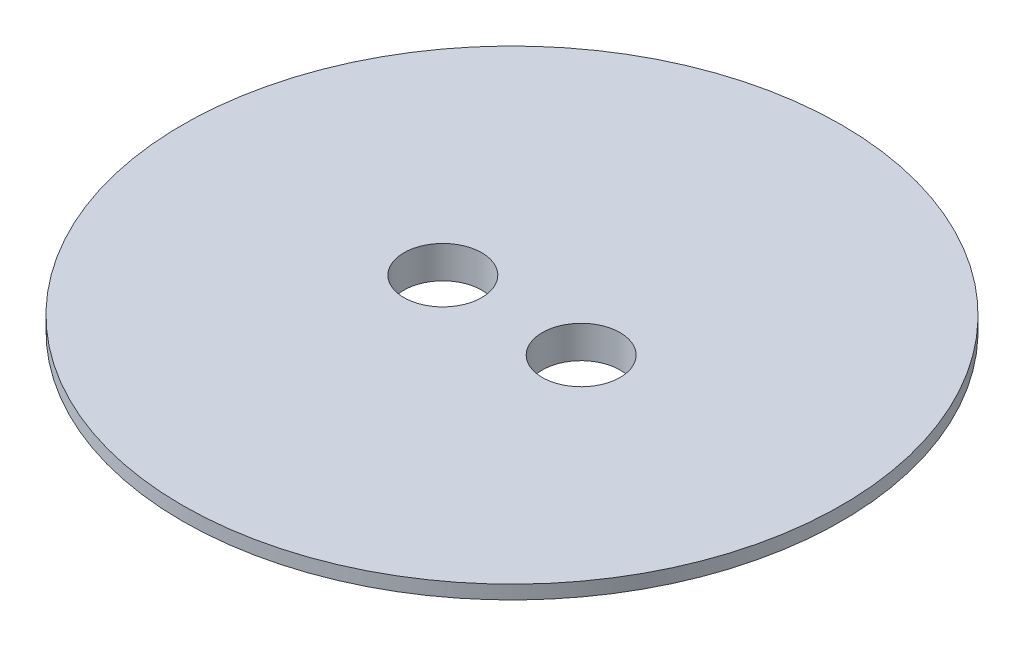
ISO-10303-21;
HEADER;
FILE_DESCRIPTION(('STEP AP214'),'2;1');
FILE_NAME('part.step','',(''),(''),'','','');
FILE_SCHEMA(('AUTOMOTIVE_DESIGN { 1 0 10303 214 1 1 1 1 }'));
ENDSEC;
DATA;
#1=APPLICATION_CONTEXT('core data for automotive mechanical design processes');
#2=APPLICATION_PROTOCOL_DEFINITION('international standard','automotive_design',2000,#1);
#3=PRODUCT_CONTEXT('',#1,'mechanical');
#4=PRODUCT('Part','Part','',(#3));
#5=PRODUCT_RELATED_PRODUCT_CATEGORY('part','',(#4));
#6=PRODUCT_DEFINITION_FORMATION('','',#4);
#7=PRODUCT_DEFINITION_CONTEXT('part definition',#1,'design');
#8=PRODUCT_DEFINITION('design','',#6,#7);
#9=PRODUCT_DEFINITION_SHAPE('','',#8);
#10=(LENGTH_UNIT() NAMED_UNIT(*) SI_UNIT(.MILLI.,.METRE.));
#11=(NAMED_UNIT(*) PLANE_ANGLE_UNIT() SI_UNIT($,.RADIAN.));
#12=(NAMED_UNIT(*) SI_UNIT($,.STERADIAN.) SOLID_ANGLE_UNIT());
#13=UNCERTAINTY_MEASURE_WITH_UNIT(LENGTH_MEASURE(1.E-05),#10,'distance_accuracy_value','');
#14=(GEOMETRIC_REPRESENTATION_CONTEXT(3) GLOBAL_UNCERTAINTY_ASSIGNED_CONTEXT((#13)) GLOBAL_UNIT_ASSIGNED_CONTEXT((#10,
#11,#12)) REPRESENTATION_CONTEXT('',''));
#15=CARTESIAN_POINT('',(0.,0.,0.));
#16=DIRECTION('',(0.,0.,1.));
#17=DIRECTION('',(1.,0.,0.));
#18=AXIS2_PLACEMENT_3D('',#15,#16,#17);
#19=CARTESIAN_POINT('',(-4.064,1.905,0.));
#20=DIRECTION('',(0.,-1.,0.));
#21=DIRECTION('',(0.,0.,-1.));
#22=AXIS2_PLACEMENT_3D('',#19,#20,#21);
#23=CYLINDRICAL_SURFACE('',#22,2.286);
#24=CARTESIAN_POINT('',(-4.064,1.905,0.));
#25=DIRECTION('',(0.,1.,0.));
#26=DIRECTION('',(0.,0.,1.));
#27=AXIS2_PLACEMENT_3D('',#24,#25,#26);
#28=CIRCLE('',#27,2.286);
#29=CARTESIAN_POINT('',(-4.064,1.905,-2.286));
#30=VERTEX_POINT('',#29);
#31=EDGE_CURVE('E64',#30,#30,#28,.T.);
#32=CARTESIAN_POINT('',(-4.064,0.,0.));
#33=DIRECTION('',(0.,1.,0.));
#34=DIRECTION('',(0.,0.,1.));
#35=AXIS2_PLACEMENT_3D('',#32,#33,#34);
#36=CIRCLE('',#35,2.286);
#37=CARTESIAN_POINT('',(-4.064,0.,-2.286));
#38=VERTEX_POINT('',#37);
#39=EDGE_CURVE('E72',#38,#38,#36,.T.);
#40=CARTESIAN_POINT('',(-4.064,1.905,-2.286));
#41=CARTESIAN_POINT('',(-4.064,1.88515625,-2.286));
#42=CARTESIAN_POINT('',(-4.064,1.8653125,-2.286));
#43=CARTESIAN_POINT('',(-4.064,1.825625,-2.286));
#44=CARTESIAN_POINT('',(-4.064,1.80578125,-2.286));
#45=CARTESIAN_POINT('',(-4.064,1.76609375,-2.286));
#46=CARTESIAN_POINT('',(-4.064,1.74625,-2.286));
#47=CARTESIAN_POINT('',(-4.064,1.7065625,-2.286));
#48=CARTESIAN_POINT('',(-4.064,1.68671875,-2.286));
#49=CARTESIAN_POINT('',(-4.064,1.64703125,-2.286));
#50=CARTESIAN_POINT('',(-4.064,1.6271875,-2.286));
#51=CARTESIAN_POINT('',(-4.064,1.5875,-2.286));
#52=CARTESIAN_POINT('',(-4.064,1.56765625,-2.286));
#53=CARTESIAN_POINT('',(-4.064,1.52796875,-2.286));
#54=CARTESIAN_POINT('',(-4.064,1.508125,-2.286));
#55=CARTESIAN_POINT('',(-4.064,1.4684375,-2.286));
#56=CARTESIAN_POINT('',(-4.064,1.44859375,-2.286));
#57=CARTESIAN_POINT('',(-4.064,1.40890625,-2.286));
#58=CARTESIAN_POINT('',(-4.064,1.3890625,-2.286));
#59=CARTESIAN_POINT('',(-4.064,1.349375,-2.286));
#60=CARTESIAN_POINT('',(-4.064,1.32953125,-2.286));
#61=CARTESIAN_POINT('',(-4.064,1.28984375,-2.286));
#62=CARTESIAN_POINT('',(-4.064,1.27,-2.286));
#63=CARTESIAN_POINT('',(-4.064,1.2303125,-2.286));
#64=CARTESIAN_POINT('',(-4.064,1.21046875,-2.286));
#65=CARTESIAN_POINT('',(-4.064,1.17078125,-2.286));
#66=CARTESIAN_POINT('',(-4.064,1.1509375,-2.286));
#67=CARTESIAN_POINT('',(-4.064,1.11125,-2.286));
#68=CARTESIAN_POINT('',(-4.064,1.09140625,-2.286));
#69=CARTESIAN_POINT('',(-4.064,1.05171875,-2.286));
#70=CARTESIAN_POINT('',(-4.064,1.031875,-2.286));
#71=CARTESIAN_POINT('',(-4.064,0.9921875,-2.286));
#72=CARTESIAN_POINT('',(-4.064,0.97234375,-2.286));
#73=CARTESIAN_POINT('',(-4.064,0.93265625,-2.286));
#74=CARTESIAN_POINT('',(-4.064,0.9128125,-2.286));
#75=CARTESIAN_POINT('',(-4.064,0.873125,-2.286));
#76=CARTESIAN_POINT('',(-4.064,0.85328125,-2.286));
#77=CARTESIAN_POINT('',(-4.064,0.81359375,-2.286));
#78=CARTESIAN_POINT('',(-4.064,0.79375,-2.286));
#79=CARTESIAN_POINT('',(-4.064,0.7540625,-2.286));
#80=CARTESIAN_POINT('',(-4.064,0.73421875,-2.286));
#81=CARTESIAN_POINT('',(-4.064,0.69453125,-2.286));
#82=CARTESIAN_POINT('',(-4.064,0.6746875,-2.286));
#83=CARTESIAN_POINT('',(-4.064,0.635,-2.286));
#84=CARTESIAN_POINT('',(-4.064,0.61515625,-2.286));
#85=CARTESIAN_POINT('',(-4.064,0.57546875,-2.286));
#86=CARTESIAN_POINT('',(-4.064,0.555625,-2.286));
#87=CARTESIAN_POINT('',(-4.064,0.5159375,-2.286));
#88=CARTESIAN_POINT('',(-4.064,0.49609375,-2.286));
#89=CARTESIAN_POINT('',(-4.064,0.45640625,-2.286));
#90=CARTESIAN_POINT('',(-4.064,0.4365625,-2.286));
#91=CARTESIAN_POINT('',(-4.064,0.396875,-2.286));
#92=CARTESIAN_POINT('',(-4.064,0.37703125,-2.286));
#93=CARTESIAN_POINT('',(-4.064,0.33734375,-2.286));
#94=CARTESIAN_POINT('',(-4.064,0.3175,-2.286));
#95=CARTESIAN_POINT('',(-4.064,0.2778125,-2.286));
#96=CARTESIAN_POINT('',(-4.064,0.25796875,-2.286));
#97=CARTESIAN_POINT('',(-4.064,0.21828125,-2.286));
#98=CARTESIAN_POINT('',(-4.064,0.1984375,-2.286));
#99=CARTESIAN_POINT('',(-4.064,0.15875,-2.286));
#100=CARTESIAN_POINT('',(-4.064,0.13890625,-2.286));
#101=CARTESIAN_POINT('',(-4.064,0.09921875,-2.286));
#102=CARTESIAN_POINT('',(-4.064,0.0793749999999999,-2.286));
#103=CARTESIAN_POINT('',(-4.064,0.0396874999999999,-2.286));
#104=CARTESIAN_POINT('',(-4.064,0.01984375,-2.286));
#105=CARTESIAN_POINT('',(-4.064,0.,-2.286));
#106=B_SPLINE_CURVE_WITH_KNOTS('',3,(#40,#41,#42,#43,#44,#45,#46,#47,#48,#49,#50,#51,#52,#53,
#54,#55,#56,#57,#58,#59,#60,#61,#62,#63,#64,#65,#66,#67,#68,#69,#70,#71,#72,#73,#74,#75,#76,#77,
#78,#79,#80,#81,#82,#83,#84,#85,#86,#87,#88,#89,#90,#91,#92,#93,#94,#95,#96,#97,#98,#99,#100,
#101,#102,#103,#104,#105),.UNSPECIFIED.,.F.,.F.,(4,2,2,2,2,2,2,2,2,2,2,2,2,2,2,2,2,2,2,2,2,2,2,
2,2,2,2,2,2,2,2,2,4),(0.,0.0595312499999999,0.1190625,0.17859375,0.238125,0.29765625,0.3571875,
0.41671875,0.47625,0.53578125,0.5953125,0.65484375,0.714375,0.77390625,0.833437499999999,
0.89296875,0.9525,1.01203125,1.0715625,1.13109375,1.190625,1.25015625,1.3096875,1.36921875,
1.42875,1.48828125,1.5478125,1.60734375,1.666875,1.72640625,1.7859375,1.84546875,1.905),.UNSPECIFIED.);
#107=EDGE_CURVE('BSEAM45',#30,#38,#106,.T.);
#108=ORIENTED_EDGE('',*,*,#31,.T.);
#109=ORIENTED_EDGE('',*,*,#39,.F.);
#110=ORIENTED_EDGE('',*,*,#107,.T.);
#111=ORIENTED_EDGE('',*,*,#107,.F.);
#112=EDGE_LOOP('',(#108,#110,#109,#111));
#113=FACE_BOUND('',#112,.T.);
#114=ADVANCED_FACE('F45',(#113),#23,.F.);
#115=CARTESIAN_POINT('',(0.,1.905,0.));
#116=DIRECTION('',(0.,-1.,0.));
#117=DIRECTION('',(0.,0.,-1.));
#118=AXIS2_PLACEMENT_3D('',#115,#116,#117);
#119=CYLINDRICAL_SURFACE('',#118,19.3675);
#120=CARTESIAN_POINT('',(0.,1.09985226280624,0.));
#121=DIRECTION('',(0.,1.,0.));
#122=DIRECTION('',(0.,0.,1.));
#123=AXIS2_PLACEMENT_3D('',#120,#121,#122);
#124=CIRCLE('',#123,19.3675);
#125=CARTESIAN_POINT('',(0.,1.09985226280624,-19.3675));
#126=VERTEX_POINT('',#125);
#127=EDGE_CURVE('E54',#126,#126,#124,.T.);
#128=CARTESIAN_POINT('',(0.,1.905,0.));
#129=DIRECTION('',(0.,1.,0.));
#130=DIRECTION('',(0.,0.,1.));
#131=AXIS2_PLACEMENT_3D('',#128,#129,#130);
#132=CIRCLE('',#131,19.3675);
#133=CARTESIAN_POINT('',(0.,1.905,-19.3675));
#134=VERTEX_POINT('',#133);
#135=EDGE_CURVE('E71',#134,#134,#132,.T.);
#136=CARTESIAN_POINT('',(0.,1.09985226280624,-19.3675));
#137=CARTESIAN_POINT('',(0.,1.10823921840201,-19.3675));
#138=CARTESIAN_POINT('',(0.,1.11662617399778,-19.3675));
#139=CARTESIAN_POINT('',(0.,1.13340008518932,-19.3675));
#140=CARTESIAN_POINT('',(0.,1.14178704078508,-19.3675));
#141=CARTESIAN_POINT('',(0.,1.15856095197662,-19.3675));
#142=CARTESIAN_POINT('',(0.,1.16694790757239,-19.3675));
#143=CARTESIAN_POINT('',(0.,1.18372181876393,-19.3675));
#144=CARTESIAN_POINT('',(0.,1.19210877435969,-19.3675));
#145=CARTESIAN_POINT('',(0.,1.20888268555123,-19.3675));
#146=CARTESIAN_POINT('',(0.,1.217269641147,-19.3675));
#147=CARTESIAN_POINT('',(0.,1.23404355233853,-19.3675));
#148=CARTESIAN_POINT('',(0.,1.2424305079343,-19.3675));
#149=CARTESIAN_POINT('',(0.,1.25920441912584,-19.3675));
#150=CARTESIAN_POINT('',(0.,1.26759137472161,-19.3675));
#151=CARTESIAN_POINT('',(0.,1.28436528591314,-19.3675));
#152=CARTESIAN_POINT('',(0.,1.29275224150891,-19.3675));
#153=CARTESIAN_POINT('',(0.,1.30952615270045,-19.3675));
#154=CARTESIAN_POINT('',(0.,1.31791310829622,-19.3675));
#155=CARTESIAN_POINT('',(0.,1.33468701948775,-19.3675));
#156=CARTESIAN_POINT('',(0.,1.34307397508352,-19.3675));
#157=CARTESIAN_POINT('',(0.,1.35984788627506,-19.3675));
#158=CARTESIAN_POINT('',(0.,1.36823484187083,-19.3675));
#159=CARTESIAN_POINT('',(0.,1.38500875306236,-19.3675));
#160=CARTESIAN_POINT('',(0.,1.39339570865813,-19.3675));
#161=CARTESIAN_POINT('',(0.,1.41016961984967,-19.3675));
#162=CARTESIAN_POINT('',(0.,1.41855657544544,-19.3675));
#163=CARTESIAN_POINT('',(0.,1.43533048663697,-19.3675));
#164=CARTESIAN_POINT('',(0.,1.44371744223274,-19.3675));
#165=CARTESIAN_POINT('',(0.,1.46049135342428,-19.3675));
#166=CARTESIAN_POINT('',(0.,1.46887830902005,-19.3675));
#167=CARTESIAN_POINT('',(0.,1.48565222021158,-19.3675));
#168=CARTESIAN_POINT('',(0.,1.49403917580735,-19.3675));
#169=CARTESIAN_POINT('',(0.,1.51081308699889,-19.3675));
#170=CARTESIAN_POINT('',(0.,1.51920004259466,-19.3675));
#171=CARTESIAN_POINT('',(0.,1.53597395378619,-19.3675));
#172=CARTESIAN_POINT('',(0.,1.54436090938196,-19.3675));
#173=CARTESIAN_POINT('',(0.,1.5611348205735,-19.3675));
#174=CARTESIAN_POINT('',(0.,1.56952177616927,-19.3675));
#175=CARTESIAN_POINT('',(0.,1.5862956873608,-19.3675));
#176=CARTESIAN_POINT('',(0.,1.59468264295657,-19.3675));
#177=CARTESIAN_POINT('',(0.,1.61145655414811,-19.3675));
#178=CARTESIAN_POINT('',(0.,1.61984350974388,-19.3675));
#179=CARTESIAN_POINT('',(0.,1.63661742093541,-19.3675));
#180=CARTESIAN_POINT('',(0.,1.64500437653118,-19.3675));
#181=CARTESIAN_POINT('',(0.,1.66177828772272,-19.3675));
#182=CARTESIAN_POINT('',(0.,1.67016524331849,-19.3675));
#183=CARTESIAN_POINT('',(0.,1.68693915451002,-19.3675));
#184=CARTESIAN_POINT('',(0.,1.69532611010579,-19.3675));
#185=CARTESIAN_POINT('',(0.,1.71210002129733,-19.3675));
#186=CARTESIAN_POINT('',(0.,1.7204869768931,-19.3675));
#187=CARTESIAN_POINT('',(0.,1.73726088808463,-19.3675));
#188=CARTESIAN_POINT('',(0.,1.7456478436804,-19.3675));
#189=CARTESIAN_POINT('',(0.,1.76242175487194,-19.3675));
#190=CARTESIAN_POINT('',(0.,1.77080871046771,-19.3675));
#191=CARTESIAN_POINT('',(0.,1.78758262165924,-19.3675));
#192=CARTESIAN_POINT('',(0.,1.79596957725501,-19.3675));
#193=CARTESIAN_POINT('',(0.,1.81274348844655,-19.3675));
#194=CARTESIAN_POINT('',(0.,1.82113044404232,-19.3675));
#195=CARTESIAN_POINT('',(0.,1.83790435523385,-19.3675));
#196=CARTESIAN_POINT('',(0.,1.84629131082962,-19.3675));
#197=CARTESIAN_POINT('',(0.,1.86306522202116,-19.3675));
#198=CARTESIAN_POINT('',(0.,1.87145217761693,-19.3675));
#199=CARTESIAN_POINT('',(0.,1.88822608880846,-19.3675));
#200=CARTESIAN_POINT('',(0.,1.89661304440423,-19.3675));
#201=CARTESIAN_POINT('',(0.,1.905,-19.3675));
#202=B_SPLINE_CURVE_WITH_KNOTS('',3,(#136,#137,#138,#139,#140,#141,#142,#143,#144,#145,#146,
#147,#148,#149,#150,#151,#152,#153,#154,#155,#156,#157,#158,#159,#160,#161,#162,#163,#164,#165,
#166,#167,#168,#169,#170,#171,#172,#173,#174,#175,#176,#177,#178,#179,#180,#181,#182,#183,#184,
#185,#186,#187,#188,#189,#190,#191,#192,#193,#194,#195,#196,#197,#198,#199,#200,#201),
.UNSPECIFIED.,.F.,.F.,(4,2,2,2,2,2,2,2,2,2,2,2,2,2,2,2,2,2,2,2,2,2,2,2,2,2,2,2,2,2,2,2,4),(0.,
0.0251608667873049,0.0503217335746098,0.0754826003619147,0.10064346714922,0.125804333936524,
0.150965200723829,0.176126067511134,0.201286934298439,0.226447801085744,0.251608667873049,
0.276769534660354,0.301930401447659,0.327091268234964,0.352252135022269,0.377413001809574,
0.402573868596879,0.427734735384184,0.452895602171488,0.478056468958793,0.503217335746099,
0.528378202533403,0.553539069320708,0.578699936108013,0.603860802895318,0.629021669682623,
0.654182536469928,0.679343403257233,0.704504270044538,0.729665136831843,0.754826003619148,
0.779986870406453,0.805147737193758),.UNSPECIFIED.);
#203=EDGE_CURVE('BSEAM86',#126,#134,#202,.T.);
#204=ORIENTED_EDGE('',*,*,#127,.T.);
#205=ORIENTED_EDGE('',*,*,#135,.F.);
#206=ORIENTED_EDGE('',*,*,#203,.T.);
#207=ORIENTED_EDGE('',*,*,#203,.F.);
#208=EDGE_LOOP('',(#204,#206,#205,#207));
#209=FACE_BOUND('',#208,.T.);
#210=ADVANCED_FACE('F86',(#209),#119,.T.);
#211=CARTESIAN_POINT('',(4.064,1.905,0.));
#212=DIRECTION('',(0.,-1.,0.));
#213=DIRECTION('',(0.,0.,-1.));
#214=AXIS2_PLACEMENT_3D('',#211,#212,#213);
#215=CYLINDRICAL_SURFACE('',#214,2.286);
#216=CARTESIAN_POINT('',(4.064,1.905,0.));
#217=DIRECTION('',(0.,1.,0.));
#218=DIRECTION('',(0.,0.,1.));
#219=AXIS2_PLACEMENT_3D('',#216,#217,#218);
#220=CIRCLE('',#219,2.286);
#221=CARTESIAN_POINT('',(4.064,1.905,-2.286));
#222=VERTEX_POINT('',#221);
#223=EDGE_CURVE('E59',#222,#222,#220,.F.);
#224=CARTESIAN_POINT('',(4.064,0.,0.));
#225=DIRECTION('',(0.,1.,0.));
#226=DIRECTION('',(0.,0.,1.));
#227=AXIS2_PLACEMENT_3D('',#224,#225,#226);
#228=CIRCLE('',#227,2.286);
#229=CARTESIAN_POINT('',(4.064,0.,-2.286));
#230=VERTEX_POINT('',#229);
#231=EDGE_CURVE('E67',#230,#230,#228,.F.);
#232=CARTESIAN_POINT('',(4.064,1.905,-2.286));
#233=CARTESIAN_POINT('',(4.064,1.88515625,-2.286));
#234=CARTESIAN_POINT('',(4.064,1.8653125,-2.286));
#235=CARTESIAN_POINT('',(4.064,1.825625,-2.286));
#236=CARTESIAN_POINT('',(4.064,1.80578125,-2.286));
#237=CARTESIAN_POINT('',(4.064,1.76609375,-2.286));
#238=CARTESIAN_POINT('',(4.064,1.74625,-2.286));
#239=CARTESIAN_POINT('',(4.064,1.7065625,-2.286));
#240=CARTESIAN_POINT('',(4.064,1.68671875,-2.286));
#241=CARTESIAN_POINT('',(4.064,1.64703125,-2.286));
#242=CARTESIAN_POINT('',(4.064,1.6271875,-2.286));
#243=CARTESIAN_POINT('',(4.064,1.5875,-2.286));
#244=CARTESIAN_POINT('',(4.064,1.56765625,-2.286));
#245=CARTESIAN_POINT('',(4.064,1.52796875,-2.286));
#246=CARTESIAN_POINT('',(4.064,1.508125,-2.286));
#247=CARTESIAN_POINT('',(4.064,1.4684375,-2.286));
#248=CARTESIAN_POINT('',(4.064,1.44859375,-2.286));
#249=CARTESIAN_POINT('',(4.064,1.40890625,-2.286));
#250=CARTESIAN_POINT('',(4.064,1.3890625,-2.286));
#251=CARTESIAN_POINT('',(4.064,1.349375,-2.286));
#252=CARTESIAN_POINT('',(4.064,1.32953125,-2.286));
#253=CARTESIAN_POINT('',(4.064,1.28984375,-2.286));
#254=CARTESIAN_POINT('',(4.064,1.27,-2.286));
#255=CARTESIAN_POINT('',(4.064,1.2303125,-2.286));
#256=CARTESIAN_POINT('',(4.064,1.21046875,-2.286));
#257=CARTESIAN_POINT('',(4.064,1.17078125,-2.286));
#258=CARTESIAN_POINT('',(4.064,1.1509375,-2.286));
#259=CARTESIAN_POINT('',(4.064,1.11125,-2.286));
#260=CARTESIAN_POINT('',(4.064,1.09140625,-2.286));
#261=CARTESIAN_POINT('',(4.064,1.05171875,-2.286));
#262=CARTESIAN_POINT('',(4.064,1.031875,-2.286));
#263=CARTESIAN_POINT('',(4.064,0.9921875,-2.286));
#264=CARTESIAN_POINT('',(4.064,0.97234375,-2.286));
#265=CARTESIAN_POINT('',(4.064,0.93265625,-2.286));
#266=CARTESIAN_POINT('',(4.064,0.9128125,-2.286));
#267=CARTESIAN_POINT('',(4.064,0.873125,-2.286));
#268=CARTESIAN_POINT('',(4.064,0.85328125,-2.286));
#269=CARTESIAN_POINT('',(4.064,0.81359375,-2.286));
#270=CARTESIAN_POINT('',(4.064,0.79375,-2.286));
#271=CARTESIAN_POINT('',(4.064,0.7540625,-2.286));
#272=CARTESIAN_POINT('',(4.064,0.73421875,-2.286));
#273=CARTESIAN_POINT('',(4.064,0.69453125,-2.286));
#274=CARTESIAN_POINT('',(4.064,0.6746875,-2.286));
#275=CARTESIAN_POINT('',(4.064,0.635,-2.286));
#276=CARTESIAN_POINT('',(4.064,0.61515625,-2.286));
#277=CARTESIAN_POINT('',(4.064,0.57546875,-2.286));
#278=CARTESIAN_POINT('',(4.064,0.555625,-2.286));
#279=CARTESIAN_POINT('',(4.064,0.5159375,-2.286));
#280=CARTESIAN_POINT('',(4.064,0.49609375,-2.286));
#281=CARTESIAN_POINT('',(4.064,0.45640625,-2.286));
#282=CARTESIAN_POINT('',(4.064,0.4365625,-2.286));
#283=CARTESIAN_POINT('',(4.064,0.396875,-2.286));
#284=CARTESIAN_POINT('',(4.064,0.37703125,-2.286));
#285=CARTESIAN_POINT('',(4.064,0.33734375,-2.286));
#286=CARTESIAN_POINT('',(4.064,0.3175,-2.286));
#287=CARTESIAN_POINT('',(4.064,0.2778125,-2.286));
#288=CARTESIAN_POINT('',(4.064,0.25796875,-2.286));
#289=CARTESIAN_POINT('',(4.064,0.21828125,-2.286));
#290=CARTESIAN_POINT('',(4.064,0.1984375,-2.286));
#291=CARTESIAN_POINT('',(4.064,0.15875,-2.286));
#292=CARTESIAN_POINT('',(4.064,0.13890625,-2.286));
#293=CARTESIAN_POINT('',(4.064,0.09921875,-2.286));
#294=CARTESIAN_POINT('',(4.064,0.0793749999999999,-2.286));
#295=CARTESIAN_POINT('',(4.064,0.0396874999999999,-2.286));
#296=CARTESIAN_POINT('',(4.064,0.01984375,-2.286));
#297=CARTESIAN_POINT('',(4.064,0.,-2.286));
#298=B_SPLINE_CURVE_WITH_KNOTS('',3,(#232,#233,#234,#235,#236,#237,#238,#239,#240,#241,#242,
#243,#244,#245,#246,#247,#248,#249,#250,#251,#252,#253,#254,#255,#256,#257,#258,#259,#260,#261,
#262,#263,#264,#265,#266,#267,#268,#269,#270,#271,#272,#273,#274,#275,#276,#277,#278,#279,#280,
#281,#282,#283,#284,#285,#286,#287,#288,#289,#290,#291,#292,#293,#294,#295,#296,#297),
.UNSPECIFIED.,.F.,.F.,(4,2,2,2,2,2,2,2,2,2,2,2,2,2,2,2,2,2,2,2,2,2,2,2,2,2,2,2,2,2,2,2,4),(0.,
0.0595312499999999,0.1190625,0.17859375,0.238125,0.29765625,0.3571875,0.41671875,0.47625,
0.53578125,0.5953125,0.65484375,0.714375,0.77390625,0.833437499999999,0.89296875,0.9525,
1.01203125,1.0715625,1.13109375,1.190625,1.25015625,1.3096875,1.36921875,1.42875,1.48828125,
1.5478125,1.60734375,1.666875,1.72640625,1.7859375,1.84546875,1.905),.UNSPECIFIED.);
#299=EDGE_CURVE('BSEAM88',#222,#230,#298,.T.);
#300=ORIENTED_EDGE('',*,*,#223,.F.);
#301=ORIENTED_EDGE('',*,*,#231,.T.);
#302=ORIENTED_EDGE('',*,*,#299,.T.);
#303=ORIENTED_EDGE('',*,*,#299,.F.);
#304=EDGE_LOOP('',(#300,#302,#301,#303));
#305=FACE_BOUND('',#304,.T.);
#306=ADVANCED_FACE('F88',(#305),#215,.F.);
#307=CARTESIAN_POINT('',(0.,1.905,0.));
#308=DIRECTION('',(0.,1.,0.));
#309=DIRECTION('',(0.,0.,1.));
#310=AXIS2_PLACEMENT_3D('',#307,#308,#309);
#311=PLANE('',#310);
#312=ORIENTED_EDGE('',*,*,#135,.T.);
#313=EDGE_LOOP('',(#312));
#314=FACE_BOUND('',#313,.T.);
#315=ORIENTED_EDGE('',*,*,#31,.F.);
#316=EDGE_LOOP('',(#315));
#317=FACE_BOUND('',#316,.T.);
#318=ORIENTED_EDGE('',*,*,#223,.T.);
#319=EDGE_LOOP('',(#318));
#320=FACE_BOUND('',#319,.T.);
#321=ADVANCED_FACE('F83',(#314,#317,#320),#311,.T.);
#322=CARTESIAN_POINT('',(0.,0.,0.));
#323=DIRECTION('',(0.,1.,0.));
#324=DIRECTION('',(0.,0.,1.));
#325=AXIS2_PLACEMENT_3D('',#322,#323,#324);
#326=PLANE('',#325);
#327=CARTESIAN_POINT('',(0.,0.,0.));
#328=DIRECTION('',(0.,1.,0.));
#329=DIRECTION('',(0.,0.,1.));
#330=AXIS2_PLACEMENT_3D('',#327,#328,#329);
#331=CIRCLE('',#330,17.4625);
#332=CARTESIAN_POINT('',(0.,0.,17.4625));
#333=VERTEX_POINT('',#332);
#334=EDGE_CURVE('E10',#333,#333,#331,.F.);
#335=ORIENTED_EDGE('',*,*,#334,.T.);
#336=EDGE_LOOP('',(#335));
#337=FACE_BOUND('',#336,.T.);
#338=ORIENTED_EDGE('',*,*,#39,.T.);
#339=EDGE_LOOP('',(#338));
#340=FACE_BOUND('',#339,.T.);
#341=ORIENTED_EDGE('',*,*,#231,.F.);
#342=EDGE_LOOP('',(#341));
#343=FACE_BOUND('',#342,.T.);
#344=ADVANCED_FACE('F98',(#337,#340,#343),#326,.F.);
#345=CARTESIAN_POINT('',(0.,1.09985226280624,0.));
#346=DIRECTION('',(0.,1.,0.));
#347=DIRECTION('',(0.,0.,1.));
#348=AXIS2_PLACEMENT_3D('',#345,#346,#347);
#349=CONICAL_SURFACE('',#348,19.3675,1.0471975511966);
#350=ORIENTED_EDGE('',*,*,#334,.F.);
#351=EDGE_LOOP('',(#350));
#352=FACE_BOUND('',#351,.T.);
#353=ORIENTED_EDGE('',*,*,#127,.F.);
#354=EDGE_LOOP('',(#353));
#355=FACE_BOUND('',#354,.T.);
#356=ADVANCED_FACE('F48',(#352,#355),#349,.T.);
#357=CLOSED_SHELL('',(#114,#210,#306,#321,#344,#356));
#358=MANIFOLD_SOLID_BREP('B2',#357);
#359=ADVANCED_BREP_SHAPE_REPRESENTATION('',(#18,#358),#14);
#360=SHAPE_DEFINITION_REPRESENTATION(#9,#359);
ENDSEC;
END-ISO-10303-21;
